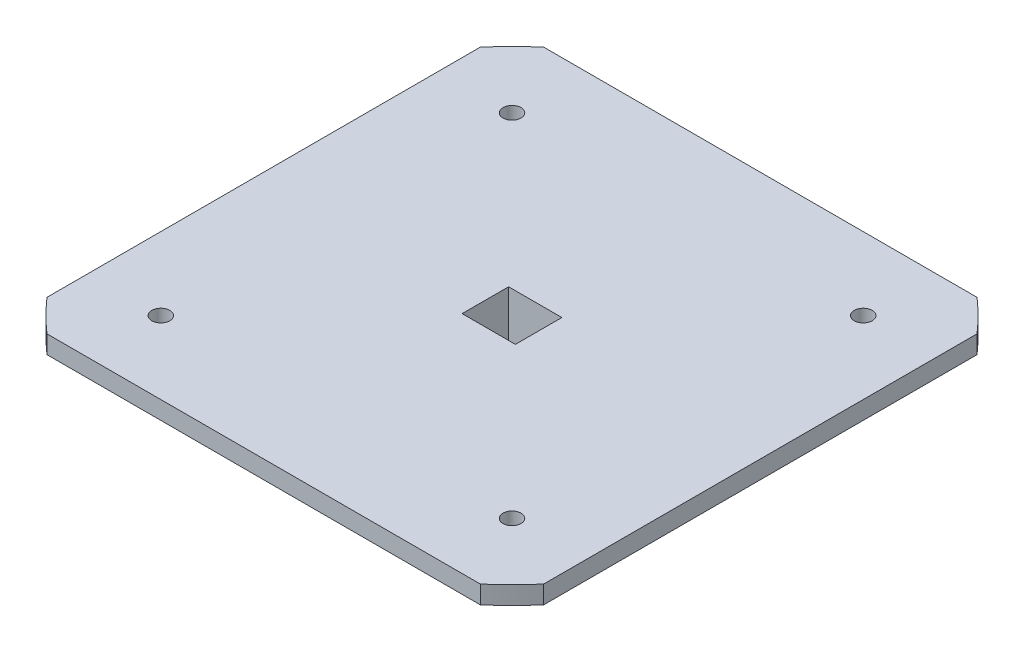
ISO-10303-21;
HEADER;
FILE_DESCRIPTION(('STEP AP214'),'2;1');
FILE_NAME('part.step','',(''),(''),'','','');
FILE_SCHEMA(('AUTOMOTIVE_DESIGN { 1 0 10303 214 1 1 1 1 }'));
ENDSEC;
DATA;
#1=APPLICATION_CONTEXT('core data for automotive mechanical design processes');
#2=APPLICATION_PROTOCOL_DEFINITION('international standard','automotive_design',2000,#1);
#3=PRODUCT_CONTEXT('',#1,'mechanical');
#4=PRODUCT('Part','Part','',(#3));
#5=PRODUCT_RELATED_PRODUCT_CATEGORY('part','',(#4));
#6=PRODUCT_DEFINITION_FORMATION('','',#4);
#7=PRODUCT_DEFINITION_CONTEXT('part definition',#1,'design');
#8=PRODUCT_DEFINITION('design','',#6,#7);
#9=PRODUCT_DEFINITION_SHAPE('','',#8);
#10=(LENGTH_UNIT() NAMED_UNIT(*) SI_UNIT(.MILLI.,.METRE.));
#11=(NAMED_UNIT(*) PLANE_ANGLE_UNIT() SI_UNIT($,.RADIAN.));
#12=(NAMED_UNIT(*) SI_UNIT($,.STERADIAN.) SOLID_ANGLE_UNIT());
#13=UNCERTAINTY_MEASURE_WITH_UNIT(LENGTH_MEASURE(1.E-05),#10,'distance_accuracy_value','');
#14=(GEOMETRIC_REPRESENTATION_CONTEXT(3) GLOBAL_UNCERTAINTY_ASSIGNED_CONTEXT((#13)) GLOBAL_UNIT_ASSIGNED_CONTEXT((#10,
#11,#12)) REPRESENTATION_CONTEXT('',''));
#15=CARTESIAN_POINT('',(0.,0.,0.));
#16=DIRECTION('',(0.,0.,1.));
#17=DIRECTION('',(1.,0.,0.));
#18=AXIS2_PLACEMENT_3D('',#15,#16,#17);
#19=CARTESIAN_POINT('',(-10.9,-12.,-10.15));
#20=DIRECTION('',(0.,0.,1.));
#21=DIRECTION('',(1.,0.,0.));
#22=AXIS2_PLACEMENT_3D('',#19,#20,#21);
#23=PLANE('',#22);
#24=CARTESIAN_POINT('',(0.,-6.,-10.15));
#25=DIRECTION('',(0.,0.,-1.));
#26=DIRECTION('',(-1.,0.,0.));
#27=AXIS2_PLACEMENT_3D('',#24,#25,#26);
#28=CIRCLE('',#27,1.5);
#29=CARTESIAN_POINT('',(-1.11803398874989,-7.,-10.15));
#30=VERTEX_POINT('',#29);
#31=CARTESIAN_POINT('',(1.11803398874989,-7.,-10.15));
#32=VERTEX_POINT('',#31);
#33=EDGE_CURVE('E53',#30,#32,#28,.T.);
#34=ORIENTED_EDGE('',*,*,#33,.F.);
#35=DIRECTION('',(1.,0.,0.));
#36=VECTOR('',#35,1.);
#37=CARTESIAN_POINT('',(-10.9,-7.,-10.15));
#38=LINE('',#37,#36);
#39=CARTESIAN_POINT('',(-10.9,-7.,-10.15));
#40=VERTEX_POINT('',#39);
#41=EDGE_CURVE('E46',#30,#40,#38,.F.);
#42=ORIENTED_EDGE('',*,*,#41,.T.);
#43=DIRECTION('',(0.,1.,0.));
#44=VECTOR('',#43,1.);
#45=CARTESIAN_POINT('',(-10.9,-12.,-10.15));
#46=LINE('',#45,#44);
#47=CARTESIAN_POINT('',(-10.9,0.,-10.15));
#48=VERTEX_POINT('',#47);
#49=EDGE_CURVE('E221',#40,#48,#46,.T.);
#50=ORIENTED_EDGE('',*,*,#49,.T.);
#51=DIRECTION('',(1.,0.,0.));
#52=VECTOR('',#51,1.);
#53=CARTESIAN_POINT('',(-10.9,0.,-10.15));
#54=LINE('',#53,#52);
#55=CARTESIAN_POINT('',(10.9,0.,-10.15));
#56=VERTEX_POINT('',#55);
#57=EDGE_CURVE('E216',#48,#56,#54,.T.);
#58=ORIENTED_EDGE('',*,*,#57,.T.);
#59=DIRECTION('',(0.,1.,0.));
#60=VECTOR('',#59,1.);
#61=CARTESIAN_POINT('',(10.9,-12.,-10.15));
#62=LINE('',#61,#60);
#63=CARTESIAN_POINT('',(10.9,-7.,-10.15));
#64=VERTEX_POINT('',#63);
#65=EDGE_CURVE('E219',#64,#56,#62,.T.);
#66=ORIENTED_EDGE('',*,*,#65,.F.);
#67=EDGE_CURVE('E11',#64,#32,#38,.F.);
#68=ORIENTED_EDGE('',*,*,#67,.T.);
#69=EDGE_LOOP('',(#34,#42,#50,#58,#66,#68));
#70=FACE_BOUND('',#69,.T.);
#71=ADVANCED_FACE('F37',(#70),#23,.F.);
#72=CARTESIAN_POINT('',(0.,0.,0.));
#73=DIRECTION('',(0.,1.,0.));
#74=DIRECTION('',(0.,0.,1.));
#75=AXIS2_PLACEMENT_3D('',#72,#73,#74);
#76=PLANE('',#75);
#77=CARTESIAN_POINT('',(0.,0.,0.));
#78=DIRECTION('',(0.,1.,0.));
#79=DIRECTION('',(0.,0.,1.));
#80=AXIS2_PLACEMENT_3D('',#77,#78,#79);
#81=CIRCLE('',#80,73.);
#82=CARTESIAN_POINT('',(48.,0.,55.));
#83=VERTEX_POINT('',#82);
#84=CARTESIAN_POINT('',(55.,0.,48.));
#85=VERTEX_POINT('',#84);
#86=EDGE_CURVE('E269',#83,#85,#81,.T.);
#87=ORIENTED_EDGE('',*,*,#86,.F.);
#88=DIRECTION('',(1.,0.,0.));
#89=VECTOR('',#88,1.);
#90=CARTESIAN_POINT('',(48.,0.,55.));
#91=LINE('',#90,#89);
#92=CARTESIAN_POINT('',(-48.,0.,55.));
#93=VERTEX_POINT('',#92);
#94=EDGE_CURVE('E274',#93,#83,#91,.T.);
#95=ORIENTED_EDGE('',*,*,#94,.F.);
#96=CARTESIAN_POINT('',(0.,0.,0.));
#97=DIRECTION('',(0.,1.,0.));
#98=DIRECTION('',(0.,0.,1.));
#99=AXIS2_PLACEMENT_3D('',#96,#97,#98);
#100=CIRCLE('',#99,73.);
#101=CARTESIAN_POINT('',(-55.,0.,48.));
#102=VERTEX_POINT('',#101);
#103=EDGE_CURVE('E301',#102,#93,#100,.T.);
#104=ORIENTED_EDGE('',*,*,#103,.F.);
#105=DIRECTION('',(0.,0.,1.));
#106=VECTOR('',#105,1.);
#107=CARTESIAN_POINT('',(-55.,0.,48.));
#108=LINE('',#107,#106);
#109=CARTESIAN_POINT('',(-55.,0.,-48.));
#110=VERTEX_POINT('',#109);
#111=EDGE_CURVE('E299',#110,#102,#108,.T.);
#112=ORIENTED_EDGE('',*,*,#111,.F.);
#113=CARTESIAN_POINT('',(0.,0.,0.));
#114=DIRECTION('',(0.,1.,0.));
#115=DIRECTION('',(0.,0.,1.));
#116=AXIS2_PLACEMENT_3D('',#113,#114,#115);
#117=CIRCLE('',#116,73.);
#118=CARTESIAN_POINT('',(-48.,0.,-55.));
#119=VERTEX_POINT('',#118);
#120=EDGE_CURVE('E297',#119,#110,#117,.T.);
#121=ORIENTED_EDGE('',*,*,#120,.F.);
#122=DIRECTION('',(-1.,0.,0.));
#123=VECTOR('',#122,1.);
#124=CARTESIAN_POINT('',(-48.,0.,-55.));
#125=LINE('',#124,#123);
#126=CARTESIAN_POINT('',(48.,0.,-55.));
#127=VERTEX_POINT('',#126);
#128=EDGE_CURVE('E295',#127,#119,#125,.T.);
#129=ORIENTED_EDGE('',*,*,#128,.F.);
#130=CARTESIAN_POINT('',(0.,0.,0.));
#131=DIRECTION('',(0.,1.,0.));
#132=DIRECTION('',(0.,0.,1.));
#133=AXIS2_PLACEMENT_3D('',#130,#131,#132);
#134=CIRCLE('',#133,73.);
#135=CARTESIAN_POINT('',(55.,0.,-48.));
#136=VERTEX_POINT('',#135);
#137=EDGE_CURVE('E293',#136,#127,#134,.T.);
#138=ORIENTED_EDGE('',*,*,#137,.F.);
#139=DIRECTION('',(0.,0.,-1.));
#140=VECTOR('',#139,1.);
#141=CARTESIAN_POINT('',(55.,0.,-48.));
#142=LINE('',#141,#140);
#143=EDGE_CURVE('E291',#85,#136,#142,.T.);
#144=ORIENTED_EDGE('',*,*,#143,.F.);
#145=EDGE_LOOP('',(#87,#95,#104,#112,#121,#129,#138,#144));
#146=FACE_BOUND('',#145,.T.);
#147=CARTESIAN_POINT('',(-38.8908729652603,0.,-38.8908729652599));
#148=DIRECTION('',(0.,1.,0.));
#149=DIRECTION('',(0.,0.,1.));
#150=AXIS2_PLACEMENT_3D('',#147,#148,#149);
#151=CIRCLE('',#150,2.);
#152=CARTESIAN_POINT('',(-38.8908729652603,0.,-36.8908729652599));
#153=VERTEX_POINT('',#152);
#154=EDGE_CURVE('E266',#153,#153,#151,.T.);
#155=ORIENTED_EDGE('',*,*,#154,.T.);
#156=EDGE_LOOP('',(#155));
#157=FACE_BOUND('',#156,.T.);
#158=CARTESIAN_POINT('',(-38.8908729652599,0.,38.8908729652603));
#159=DIRECTION('',(0.,1.,0.));
#160=DIRECTION('',(0.,0.,1.));
#161=AXIS2_PLACEMENT_3D('',#158,#159,#160);
#162=CIRCLE('',#161,2.);
#163=CARTESIAN_POINT('',(-38.8908729652599,0.,40.8908729652603));
#164=VERTEX_POINT('',#163);
#165=EDGE_CURVE('E260',#164,#164,#162,.T.);
#166=ORIENTED_EDGE('',*,*,#165,.T.);
#167=EDGE_LOOP('',(#166));
#168=FACE_BOUND('',#167,.T.);
#169=CARTESIAN_POINT('',(38.8908729652603,0.,38.8908729652599));
#170=DIRECTION('',(0.,1.,0.));
#171=DIRECTION('',(0.,0.,1.));
#172=AXIS2_PLACEMENT_3D('',#169,#170,#171);
#173=CIRCLE('',#172,2.);
#174=CARTESIAN_POINT('',(38.8908729652603,0.,40.8908729652599));
#175=VERTEX_POINT('',#174);
#176=EDGE_CURVE('E254',#175,#175,#173,.T.);
#177=ORIENTED_EDGE('',*,*,#176,.T.);
#178=EDGE_LOOP('',(#177));
#179=FACE_BOUND('',#178,.T.);
#180=CARTESIAN_POINT('',(38.8908729652599,0.,-38.8908729652603));
#181=DIRECTION('',(0.,1.,0.));
#182=DIRECTION('',(0.,0.,1.));
#183=AXIS2_PLACEMENT_3D('',#180,#181,#182);
#184=CIRCLE('',#183,2.);
#185=CARTESIAN_POINT('',(38.8908729652599,0.,-36.8908729652603));
#186=VERTEX_POINT('',#185);
#187=EDGE_CURVE('E248',#186,#186,#184,.T.);
#188=ORIENTED_EDGE('',*,*,#187,.T.);
#189=EDGE_LOOP('',(#188));
#190=FACE_BOUND('',#189,.T.);
#191=DIRECTION('',(0.,0.,1.));
#192=VECTOR('',#191,1.);
#193=CARTESIAN_POINT('',(10.9,0.,-10.15));
#194=LINE('',#193,#192);
#195=CARTESIAN_POINT('',(10.9,0.,10.15));
#196=VERTEX_POINT('',#195);
#197=EDGE_CURVE('E207',#56,#196,#194,.T.);
#198=ORIENTED_EDGE('',*,*,#197,.F.);
#199=ORIENTED_EDGE('',*,*,#57,.F.);
#200=DIRECTION('',(0.,0.,-1.));
#201=VECTOR('',#200,1.);
#202=CARTESIAN_POINT('',(-10.9,0.,10.15));
#203=LINE('',#202,#201);
#204=CARTESIAN_POINT('',(-10.9,0.,10.15));
#205=VERTEX_POINT('',#204);
#206=EDGE_CURVE('E213',#205,#48,#203,.T.);
#207=ORIENTED_EDGE('',*,*,#206,.F.);
#208=DIRECTION('',(-1.,0.,0.));
#209=VECTOR('',#208,1.);
#210=CARTESIAN_POINT('',(10.9,0.,10.15));
#211=LINE('',#210,#209);
#212=EDGE_CURVE('E210',#196,#205,#211,.T.);
#213=ORIENTED_EDGE('',*,*,#212,.F.);
#214=EDGE_LOOP('',(#198,#199,#207,#213));
#215=FACE_BOUND('',#214,.T.);
#216=ADVANCED_FACE('F358',(#146,#157,#168,#179,#190,#215),#76,.F.);
#217=CARTESIAN_POINT('',(0.,4.,0.));
#218=DIRECTION('',(0.,-1.,0.));
#219=DIRECTION('',(0.,0.,-1.));
#220=AXIS2_PLACEMENT_3D('',#217,#218,#219);
#221=CYLINDRICAL_SURFACE('',#220,73.);
#222=ORIENTED_EDGE('',*,*,#86,.T.);
#223=DIRECTION('',(0.,-1.,0.));
#224=VECTOR('',#223,1.);
#225=CARTESIAN_POINT('',(55.,4.,48.));
#226=LINE('',#225,#224);
#227=CARTESIAN_POINT('',(55.,4.,48.));
#228=VERTEX_POINT('',#227);
#229=EDGE_CURVE('E324',#228,#85,#226,.T.);
#230=ORIENTED_EDGE('',*,*,#229,.F.);
#231=CARTESIAN_POINT('',(0.,4.,0.));
#232=DIRECTION('',(0.,1.,0.));
#233=DIRECTION('',(0.,0.,1.));
#234=AXIS2_PLACEMENT_3D('',#231,#232,#233);
#235=CIRCLE('',#234,73.);
#236=CARTESIAN_POINT('',(48.,4.,55.));
#237=VERTEX_POINT('',#236);
#238=EDGE_CURVE('E270',#237,#228,#235,.T.);
#239=ORIENTED_EDGE('',*,*,#238,.F.);
#240=DIRECTION('',(0.,-1.,0.));
#241=VECTOR('',#240,1.);
#242=CARTESIAN_POINT('',(48.,4.,55.));
#243=LINE('',#242,#241);
#244=EDGE_CURVE('E288',#237,#83,#243,.T.);
#245=ORIENTED_EDGE('',*,*,#244,.T.);
#246=EDGE_LOOP('',(#222,#230,#239,#245));
#247=FACE_BOUND('',#246,.T.);
#248=ADVANCED_FACE('F360',(#247),#221,.T.);
#249=CARTESIAN_POINT('',(55.,4.,-48.));
#250=DIRECTION('',(-1.,0.,0.));
#251=DIRECTION('',(0.,0.,1.));
#252=AXIS2_PLACEMENT_3D('',#249,#250,#251);
#253=PLANE('',#252);
#254=ORIENTED_EDGE('',*,*,#143,.T.);
#255=DIRECTION('',(0.,-1.,0.));
#256=VECTOR('',#255,1.);
#257=CARTESIAN_POINT('',(55.,4.,-48.));
#258=LINE('',#257,#256);
#259=CARTESIAN_POINT('',(55.,4.,-48.));
#260=VERTEX_POINT('',#259);
#261=EDGE_CURVE('E321',#260,#136,#258,.T.);
#262=ORIENTED_EDGE('',*,*,#261,.F.);
#263=DIRECTION('',(0.,0.,-1.));
#264=VECTOR('',#263,1.);
#265=CARTESIAN_POINT('',(55.,4.,-48.));
#266=LINE('',#265,#264);
#267=EDGE_CURVE('E273',#228,#260,#266,.T.);
#268=ORIENTED_EDGE('',*,*,#267,.F.);
#269=ORIENTED_EDGE('',*,*,#229,.T.);
#270=EDGE_LOOP('',(#254,#262,#268,#269));
#271=FACE_BOUND('',#270,.T.);
#272=ADVANCED_FACE('F367',(#271),#253,.F.);
#273=CARTESIAN_POINT('',(0.,4.,0.));
#274=DIRECTION('',(0.,-1.,0.));
#275=DIRECTION('',(0.,0.,-1.));
#276=AXIS2_PLACEMENT_3D('',#273,#274,#275);
#277=CYLINDRICAL_SURFACE('',#276,73.);
#278=ORIENTED_EDGE('',*,*,#137,.T.);
#279=DIRECTION('',(0.,-1.,0.));
#280=VECTOR('',#279,1.);
#281=CARTESIAN_POINT('',(48.,4.,-55.));
#282=LINE('',#281,#280);
#283=CARTESIAN_POINT('',(48.,4.,-55.));
#284=VERTEX_POINT('',#283);
#285=EDGE_CURVE('E318',#284,#127,#282,.T.);
#286=ORIENTED_EDGE('',*,*,#285,.F.);
#287=CARTESIAN_POINT('',(0.,4.,0.));
#288=DIRECTION('',(0.,1.,0.));
#289=DIRECTION('',(0.,0.,1.));
#290=AXIS2_PLACEMENT_3D('',#287,#288,#289);
#291=CIRCLE('',#290,73.);
#292=EDGE_CURVE('E276',#260,#284,#291,.T.);
#293=ORIENTED_EDGE('',*,*,#292,.F.);
#294=ORIENTED_EDGE('',*,*,#261,.T.);
#295=EDGE_LOOP('',(#278,#286,#293,#294));
#296=FACE_BOUND('',#295,.T.);
#297=ADVANCED_FACE('F396',(#296),#277,.T.);
#298=CARTESIAN_POINT('',(-48.,4.,-55.));
#299=DIRECTION('',(0.,0.,1.));
#300=DIRECTION('',(1.,0.,0.));
#301=AXIS2_PLACEMENT_3D('',#298,#299,#300);
#302=PLANE('',#301);
#303=ORIENTED_EDGE('',*,*,#128,.T.);
#304=DIRECTION('',(0.,-1.,0.));
#305=VECTOR('',#304,1.);
#306=CARTESIAN_POINT('',(-48.,4.,-55.));
#307=LINE('',#306,#305);
#308=CARTESIAN_POINT('',(-48.,4.,-55.));
#309=VERTEX_POINT('',#308);
#310=EDGE_CURVE('E315',#309,#119,#307,.T.);
#311=ORIENTED_EDGE('',*,*,#310,.F.);
#312=DIRECTION('',(-1.,0.,0.));
#313=VECTOR('',#312,1.);
#314=CARTESIAN_POINT('',(-48.,4.,-55.));
#315=LINE('',#314,#313);
#316=EDGE_CURVE('E278',#284,#309,#315,.T.);
#317=ORIENTED_EDGE('',*,*,#316,.F.);
#318=ORIENTED_EDGE('',*,*,#285,.T.);
#319=EDGE_LOOP('',(#303,#311,#317,#318));
#320=FACE_BOUND('',#319,.T.);
#321=ADVANCED_FACE('F392',(#320),#302,.F.);
#322=CARTESIAN_POINT('',(0.,4.,0.));
#323=DIRECTION('',(0.,-1.,0.));
#324=DIRECTION('',(0.,0.,-1.));
#325=AXIS2_PLACEMENT_3D('',#322,#323,#324);
#326=CYLINDRICAL_SURFACE('',#325,73.);
#327=ORIENTED_EDGE('',*,*,#120,.T.);
#328=DIRECTION('',(0.,-1.,0.));
#329=VECTOR('',#328,1.);
#330=CARTESIAN_POINT('',(-55.,4.,-48.));
#331=LINE('',#330,#329);
#332=CARTESIAN_POINT('',(-55.,4.,-48.));
#333=VERTEX_POINT('',#332);
#334=EDGE_CURVE('E312',#333,#110,#331,.T.);
#335=ORIENTED_EDGE('',*,*,#334,.F.);
#336=CARTESIAN_POINT('',(0.,4.,0.));
#337=DIRECTION('',(0.,1.,0.));
#338=DIRECTION('',(0.,0.,1.));
#339=AXIS2_PLACEMENT_3D('',#336,#337,#338);
#340=CIRCLE('',#339,73.);
#341=EDGE_CURVE('E280',#309,#333,#340,.T.);
#342=ORIENTED_EDGE('',*,*,#341,.F.);
#343=ORIENTED_EDGE('',*,*,#310,.T.);
#344=EDGE_LOOP('',(#327,#335,#342,#343));
#345=FACE_BOUND('',#344,.T.);
#346=ADVANCED_FACE('F388',(#345),#326,.T.);
#347=CARTESIAN_POINT('',(-55.,4.,48.));
#348=DIRECTION('',(1.,0.,0.));
#349=DIRECTION('',(0.,0.,-1.));
#350=AXIS2_PLACEMENT_3D('',#347,#348,#349);
#351=PLANE('',#350);
#352=ORIENTED_EDGE('',*,*,#111,.T.);
#353=DIRECTION('',(0.,-1.,0.));
#354=VECTOR('',#353,1.);
#355=CARTESIAN_POINT('',(-55.,4.,48.));
#356=LINE('',#355,#354);
#357=CARTESIAN_POINT('',(-55.,4.,48.));
#358=VERTEX_POINT('',#357);
#359=EDGE_CURVE('E309',#358,#102,#356,.T.);
#360=ORIENTED_EDGE('',*,*,#359,.F.);
#361=DIRECTION('',(0.,0.,1.));
#362=VECTOR('',#361,1.);
#363=CARTESIAN_POINT('',(-55.,4.,48.));
#364=LINE('',#363,#362);
#365=EDGE_CURVE('E282',#333,#358,#364,.T.);
#366=ORIENTED_EDGE('',*,*,#365,.F.);
#367=ORIENTED_EDGE('',*,*,#334,.T.);
#368=EDGE_LOOP('',(#352,#360,#366,#367));
#369=FACE_BOUND('',#368,.T.);
#370=ADVANCED_FACE('F384',(#369),#351,.F.);
#371=CARTESIAN_POINT('',(0.,4.,0.));
#372=DIRECTION('',(0.,-1.,0.));
#373=DIRECTION('',(0.,0.,-1.));
#374=AXIS2_PLACEMENT_3D('',#371,#372,#373);
#375=CYLINDRICAL_SURFACE('',#374,73.);
#376=ORIENTED_EDGE('',*,*,#103,.T.);
#377=DIRECTION('',(0.,-1.,0.));
#378=VECTOR('',#377,1.);
#379=CARTESIAN_POINT('',(-48.,4.,55.));
#380=LINE('',#379,#378);
#381=CARTESIAN_POINT('',(-48.,4.,55.));
#382=VERTEX_POINT('',#381);
#383=EDGE_CURVE('E306',#382,#93,#380,.T.);
#384=ORIENTED_EDGE('',*,*,#383,.F.);
#385=CARTESIAN_POINT('',(0.,4.,0.));
#386=DIRECTION('',(0.,1.,0.));
#387=DIRECTION('',(0.,0.,1.));
#388=AXIS2_PLACEMENT_3D('',#385,#386,#387);
#389=CIRCLE('',#388,73.);
#390=EDGE_CURVE('E284',#358,#382,#389,.T.);
#391=ORIENTED_EDGE('',*,*,#390,.F.);
#392=ORIENTED_EDGE('',*,*,#359,.T.);
#393=EDGE_LOOP('',(#376,#384,#391,#392));
#394=FACE_BOUND('',#393,.T.);
#395=ADVANCED_FACE('F380',(#394),#375,.T.);
#396=CARTESIAN_POINT('',(48.,4.,55.));
#397=DIRECTION('',(0.,0.,-1.));
#398=DIRECTION('',(-1.,0.,0.));
#399=AXIS2_PLACEMENT_3D('',#396,#397,#398);
#400=PLANE('',#399);
#401=ORIENTED_EDGE('',*,*,#94,.T.);
#402=ORIENTED_EDGE('',*,*,#244,.F.);
#403=DIRECTION('',(1.,0.,0.));
#404=VECTOR('',#403,1.);
#405=CARTESIAN_POINT('',(48.,4.,55.));
#406=LINE('',#405,#404);
#407=EDGE_CURVE('E286',#382,#237,#406,.T.);
#408=ORIENTED_EDGE('',*,*,#407,.F.);
#409=ORIENTED_EDGE('',*,*,#383,.T.);
#410=EDGE_LOOP('',(#401,#402,#408,#409));
#411=FACE_BOUND('',#410,.T.);
#412=ADVANCED_FACE('F377',(#411),#400,.F.);
#413=CARTESIAN_POINT('',(0.,4.,0.));
#414=DIRECTION('',(0.,1.,0.));
#415=DIRECTION('',(0.,0.,1.));
#416=AXIS2_PLACEMENT_3D('',#413,#414,#415);
#417=PLANE('',#416);
#418=DIRECTION('',(0.,0.,-1.));
#419=VECTOR('',#418,1.);
#420=CARTESIAN_POINT('',(5.9,4.,0.));
#421=LINE('',#420,#419);
#422=CARTESIAN_POINT('',(5.9,4.,5.15));
#423=VERTEX_POINT('',#422);
#424=CARTESIAN_POINT('',(5.9,4.,-5.15));
#425=VERTEX_POINT('',#424);
#426=EDGE_CURVE('E243',#423,#425,#421,.T.);
#427=ORIENTED_EDGE('',*,*,#426,.F.);
#428=DIRECTION('',(1.,0.,0.));
#429=VECTOR('',#428,1.);
#430=CARTESIAN_POINT('',(0.,4.,5.15));
#431=LINE('',#430,#429);
#432=CARTESIAN_POINT('',(-5.9,4.,5.15));
#433=VERTEX_POINT('',#432);
#434=EDGE_CURVE('E230',#433,#423,#431,.T.);
#435=ORIENTED_EDGE('',*,*,#434,.F.);
#436=DIRECTION('',(0.,0.,1.));
#437=VECTOR('',#436,1.);
#438=CARTESIAN_POINT('',(-5.9,4.,0.));
#439=LINE('',#438,#437);
#440=CARTESIAN_POINT('',(-5.9,4.,-5.15));
#441=VERTEX_POINT('',#440);
#442=EDGE_CURVE('E238',#441,#433,#439,.T.);
#443=ORIENTED_EDGE('',*,*,#442,.F.);
#444=DIRECTION('',(-1.,0.,0.));
#445=VECTOR('',#444,1.);
#446=CARTESIAN_POINT('',(0.,4.,-5.15));
#447=LINE('',#446,#445);
#448=EDGE_CURVE('E241',#425,#441,#447,.T.);
#449=ORIENTED_EDGE('',*,*,#448,.F.);
#450=EDGE_LOOP('',(#427,#435,#443,#449));
#451=FACE_BOUND('',#450,.T.);
#452=CARTESIAN_POINT('',(38.8908729652599,4.,-38.8908729652603));
#453=DIRECTION('',(0.,1.,0.));
#454=DIRECTION('',(0.,0.,1.));
#455=AXIS2_PLACEMENT_3D('',#452,#453,#454);
#456=CIRCLE('',#455,1.99999999999999);
#457=CARTESIAN_POINT('',(38.8908729652599,4.,-36.8908729652603));
#458=VERTEX_POINT('',#457);
#459=EDGE_CURVE('E245',#458,#458,#456,.T.);
#460=ORIENTED_EDGE('',*,*,#459,.F.);
#461=EDGE_LOOP('',(#460));
#462=FACE_BOUND('',#461,.T.);
#463=CARTESIAN_POINT('',(38.8908729652603,4.,38.8908729652599));
#464=DIRECTION('',(0.,1.,0.));
#465=DIRECTION('',(0.,0.,1.));
#466=AXIS2_PLACEMENT_3D('',#463,#464,#465);
#467=CIRCLE('',#466,1.99999999999999);
#468=CARTESIAN_POINT('',(38.8908729652603,4.,40.8908729652599));
#469=VERTEX_POINT('',#468);
#470=EDGE_CURVE('E251',#469,#469,#467,.T.);
#471=ORIENTED_EDGE('',*,*,#470,.F.);
#472=EDGE_LOOP('',(#471));
#473=FACE_BOUND('',#472,.T.);
#474=CARTESIAN_POINT('',(-38.8908729652599,4.,38.8908729652603));
#475=DIRECTION('',(0.,1.,0.));
#476=DIRECTION('',(0.,0.,1.));
#477=AXIS2_PLACEMENT_3D('',#474,#475,#476);
#478=CIRCLE('',#477,1.99999999999999);
#479=CARTESIAN_POINT('',(-38.8908729652599,4.,40.8908729652603));
#480=VERTEX_POINT('',#479);
#481=EDGE_CURVE('E257',#480,#480,#478,.T.);
#482=ORIENTED_EDGE('',*,*,#481,.F.);
#483=EDGE_LOOP('',(#482));
#484=FACE_BOUND('',#483,.T.);
#485=CARTESIAN_POINT('',(-38.8908729652603,4.,-38.8908729652599));
#486=DIRECTION('',(0.,1.,0.));
#487=DIRECTION('',(0.,0.,1.));
#488=AXIS2_PLACEMENT_3D('',#485,#486,#487);
#489=CIRCLE('',#488,1.99999999999999);
#490=CARTESIAN_POINT('',(-38.8908729652603,4.,-36.8908729652599));
#491=VERTEX_POINT('',#490);
#492=EDGE_CURVE('E263',#491,#491,#489,.T.);
#493=ORIENTED_EDGE('',*,*,#492,.F.);
#494=EDGE_LOOP('',(#493));
#495=FACE_BOUND('',#494,.T.);
#496=ORIENTED_EDGE('',*,*,#238,.T.);
#497=ORIENTED_EDGE('',*,*,#267,.T.);
#498=ORIENTED_EDGE('',*,*,#292,.T.);
#499=ORIENTED_EDGE('',*,*,#316,.T.);
#500=ORIENTED_EDGE('',*,*,#341,.T.);
#501=ORIENTED_EDGE('',*,*,#365,.T.);
#502=ORIENTED_EDGE('',*,*,#390,.T.);
#503=ORIENTED_EDGE('',*,*,#407,.T.);
#504=EDGE_LOOP('',(#496,#497,#498,#499,#500,#501,#502,#503));
#505=FACE_BOUND('',#504,.T.);
#506=ADVANCED_FACE('F375',(#451,#462,#473,#484,#495,#505),#417,.T.);
#507=CARTESIAN_POINT('',(-38.8908729652603,4.,-38.8908729652599));
#508=DIRECTION('',(0.,1.,0.));
#509=DIRECTION('',(0.,0.,1.));
#510=AXIS2_PLACEMENT_3D('',#507,#508,#509);
#511=CYLINDRICAL_SURFACE('',#510,1.99999999999999);
#512=ORIENTED_EDGE('',*,*,#154,.F.);
#513=EDGE_LOOP('',(#512));
#514=FACE_BOUND('',#513,.T.);
#515=ORIENTED_EDGE('',*,*,#492,.T.);
#516=EDGE_LOOP('',(#515));
#517=FACE_BOUND('',#516,.T.);
#518=ADVANCED_FACE('F443',(#514,#517),#511,.F.);
#519=CARTESIAN_POINT('',(-38.8908729652599,4.,38.8908729652603));
#520=DIRECTION('',(0.,1.,0.));
#521=DIRECTION('',(0.,0.,1.));
#522=AXIS2_PLACEMENT_3D('',#519,#520,#521);
#523=CYLINDRICAL_SURFACE('',#522,1.99999999999999);
#524=ORIENTED_EDGE('',*,*,#165,.F.);
#525=EDGE_LOOP('',(#524));
#526=FACE_BOUND('',#525,.T.);
#527=ORIENTED_EDGE('',*,*,#481,.T.);
#528=EDGE_LOOP('',(#527));
#529=FACE_BOUND('',#528,.T.);
#530=ADVANCED_FACE('F440',(#526,#529),#523,.F.);
#531=CARTESIAN_POINT('',(38.8908729652603,4.,38.8908729652599));
#532=DIRECTION('',(0.,1.,0.));
#533=DIRECTION('',(0.,0.,1.));
#534=AXIS2_PLACEMENT_3D('',#531,#532,#533);
#535=CYLINDRICAL_SURFACE('',#534,1.99999999999999);
#536=ORIENTED_EDGE('',*,*,#176,.F.);
#537=EDGE_LOOP('',(#536));
#538=FACE_BOUND('',#537,.T.);
#539=ORIENTED_EDGE('',*,*,#470,.T.);
#540=EDGE_LOOP('',(#539));
#541=FACE_BOUND('',#540,.T.);
#542=ADVANCED_FACE('F436',(#538,#541),#535,.F.);
#543=CARTESIAN_POINT('',(38.8908729652599,4.,-38.8908729652603));
#544=DIRECTION('',(0.,1.,0.));
#545=DIRECTION('',(0.,0.,1.));
#546=AXIS2_PLACEMENT_3D('',#543,#544,#545);
#547=CYLINDRICAL_SURFACE('',#546,1.99999999999999);
#548=ORIENTED_EDGE('',*,*,#187,.F.);
#549=EDGE_LOOP('',(#548));
#550=FACE_BOUND('',#549,.T.);
#551=ORIENTED_EDGE('',*,*,#459,.T.);
#552=EDGE_LOOP('',(#551));
#553=FACE_BOUND('',#552,.T.);
#554=ADVANCED_FACE('F433',(#550,#553),#547,.F.);
#555=CARTESIAN_POINT('',(5.9,10.,-5.15));
#556=DIRECTION('',(1.,0.,0.));
#557=DIRECTION('',(0.,0.,-1.));
#558=AXIS2_PLACEMENT_3D('',#555,#556,#557);
#559=PLANE('',#558);
#560=ORIENTED_EDGE('',*,*,#426,.T.);
#561=DIRECTION('',(0.,-1.,0.));
#562=VECTOR('',#561,1.);
#563=CARTESIAN_POINT('',(5.9,10.,-5.15));
#564=LINE('',#563,#562);
#565=CARTESIAN_POINT('',(5.9,-12.,-5.15));
#566=VERTEX_POINT('',#565);
#567=EDGE_CURVE('E228',#425,#566,#564,.T.);
#568=ORIENTED_EDGE('',*,*,#567,.T.);
#569=DIRECTION('',(0.,0.,1.));
#570=VECTOR('',#569,1.);
#571=CARTESIAN_POINT('',(5.9,-12.,-5.15));
#572=LINE('',#571,#570);
#573=CARTESIAN_POINT('',(5.9,-12.,5.15));
#574=VERTEX_POINT('',#573);
#575=EDGE_CURVE('E204',#566,#574,#572,.T.);
#576=ORIENTED_EDGE('',*,*,#575,.T.);
#577=DIRECTION('',(0.,-1.,0.));
#578=VECTOR('',#577,1.);
#579=CARTESIAN_POINT('',(5.9,10.,5.15));
#580=LINE('',#579,#578);
#581=EDGE_CURVE('E227',#423,#574,#580,.T.);
#582=ORIENTED_EDGE('',*,*,#581,.F.);
#583=EDGE_LOOP('',(#560,#568,#576,#582));
#584=FACE_BOUND('',#583,.T.);
#585=ADVANCED_FACE('F339',(#584),#559,.F.);
#586=CARTESIAN_POINT('',(-5.9,10.,-5.15));
#587=DIRECTION('',(0.,0.,-1.));
#588=DIRECTION('',(-1.,0.,0.));
#589=AXIS2_PLACEMENT_3D('',#586,#587,#588);
#590=PLANE('',#589);
#591=CARTESIAN_POINT('',(0.,-6.,-5.15));
#592=DIRECTION('',(0.,0.,-1.));
#593=DIRECTION('',(-1.,0.,0.));
#594=AXIS2_PLACEMENT_3D('',#591,#592,#593);
#595=CIRCLE('',#594,1.5);
#596=CARTESIAN_POINT('',(-1.5,-6.,-5.15));
#597=VERTEX_POINT('',#596);
#598=EDGE_CURVE('E163',#597,#597,#595,.T.);
#599=ORIENTED_EDGE('',*,*,#598,.T.);
#600=EDGE_LOOP('',(#599));
#601=FACE_BOUND('',#600,.T.);
#602=ORIENTED_EDGE('',*,*,#448,.T.);
#603=DIRECTION('',(0.,-1.,0.));
#604=VECTOR('',#603,1.);
#605=CARTESIAN_POINT('',(-5.9,10.,-5.15));
#606=LINE('',#605,#604);
#607=CARTESIAN_POINT('',(-5.9,-12.,-5.15));
#608=VERTEX_POINT('',#607);
#609=EDGE_CURVE('E231',#441,#608,#606,.T.);
#610=ORIENTED_EDGE('',*,*,#609,.T.);
#611=DIRECTION('',(1.,0.,0.));
#612=VECTOR('',#611,1.);
#613=CARTESIAN_POINT('',(-5.9,-12.,-5.15));
#614=LINE('',#613,#612);
#615=EDGE_CURVE('E192',#608,#566,#614,.T.);
#616=ORIENTED_EDGE('',*,*,#615,.T.);
#617=ORIENTED_EDGE('',*,*,#567,.F.);
#618=EDGE_LOOP('',(#602,#610,#616,#617));
#619=FACE_BOUND('',#618,.T.);
#620=ADVANCED_FACE('F344',(#601,#619),#590,.F.);
#621=CARTESIAN_POINT('',(-5.9,10.,-5.15));
#622=DIRECTION('',(-1.,0.,0.));
#623=DIRECTION('',(0.,0.,1.));
#624=AXIS2_PLACEMENT_3D('',#621,#622,#623);
#625=PLANE('',#624);
#626=ORIENTED_EDGE('',*,*,#442,.T.);
#627=DIRECTION('',(0.,-1.,0.));
#628=VECTOR('',#627,1.);
#629=CARTESIAN_POINT('',(-5.9,10.,5.15));
#630=LINE('',#629,#628);
#631=CARTESIAN_POINT('',(-5.9,-12.,5.15));
#632=VERTEX_POINT('',#631);
#633=EDGE_CURVE('E234',#433,#632,#630,.T.);
#634=ORIENTED_EDGE('',*,*,#633,.T.);
#635=DIRECTION('',(0.,0.,-1.));
#636=VECTOR('',#635,1.);
#637=CARTESIAN_POINT('',(-5.9,-12.,5.15));
#638=LINE('',#637,#636);
#639=EDGE_CURVE('E187',#632,#608,#638,.T.);
#640=ORIENTED_EDGE('',*,*,#639,.T.);
#641=ORIENTED_EDGE('',*,*,#609,.F.);
#642=EDGE_LOOP('',(#626,#634,#640,#641));
#643=FACE_BOUND('',#642,.T.);
#644=ADVANCED_FACE('F349',(#643),#625,.F.);
#645=CARTESIAN_POINT('',(-5.9,10.,5.15));
#646=DIRECTION('',(0.,0.,1.));
#647=DIRECTION('',(1.,0.,0.));
#648=AXIS2_PLACEMENT_3D('',#645,#646,#647);
#649=PLANE('',#648);
#650=ORIENTED_EDGE('',*,*,#434,.T.);
#651=ORIENTED_EDGE('',*,*,#581,.T.);
#652=DIRECTION('',(-1.,0.,0.));
#653=VECTOR('',#652,1.);
#654=CARTESIAN_POINT('',(5.9,-12.,5.15));
#655=LINE('',#654,#653);
#656=EDGE_CURVE('E181',#574,#632,#655,.T.);
#657=ORIENTED_EDGE('',*,*,#656,.T.);
#658=ORIENTED_EDGE('',*,*,#633,.F.);
#659=EDGE_LOOP('',(#650,#651,#657,#658));
#660=FACE_BOUND('',#659,.T.);
#661=ADVANCED_FACE('F423',(#660),#649,.F.);
#662=CARTESIAN_POINT('',(10.9,-12.,-10.15));
#663=DIRECTION('',(-1.,0.,0.));
#664=DIRECTION('',(0.,0.,1.));
#665=AXIS2_PLACEMENT_3D('',#662,#663,#664);
#666=PLANE('',#665);
#667=DIRECTION('',(0.,1.,0.));
#668=VECTOR('',#667,1.);
#669=CARTESIAN_POINT('',(10.9,-12.,10.15));
#670=LINE('',#669,#668);
#671=CARTESIAN_POINT('',(10.9,-7.,10.15));
#672=VERTEX_POINT('',#671);
#673=EDGE_CURVE('E225',#672,#196,#670,.T.);
#674=ORIENTED_EDGE('',*,*,#673,.F.);
#675=DIRECTION('',(0.,0.,1.));
#676=VECTOR('',#675,1.);
#677=CARTESIAN_POINT('',(10.9,-7.,-10.15));
#678=LINE('',#677,#676);
#679=EDGE_CURVE('E61',#672,#64,#678,.F.);
#680=ORIENTED_EDGE('',*,*,#679,.T.);
#681=ORIENTED_EDGE('',*,*,#65,.T.);
#682=ORIENTED_EDGE('',*,*,#197,.T.);
#683=EDGE_LOOP('',(#674,#680,#681,#682));
#684=FACE_BOUND('',#683,.T.);
#685=ADVANCED_FACE('F333',(#684),#666,.F.);
#686=CARTESIAN_POINT('',(10.9,-12.,10.15));
#687=DIRECTION('',(0.,0.,-1.));
#688=DIRECTION('',(-1.,0.,0.));
#689=AXIS2_PLACEMENT_3D('',#686,#687,#688);
#690=PLANE('',#689);
#691=DIRECTION('',(0.,1.,0.));
#692=VECTOR('',#691,1.);
#693=CARTESIAN_POINT('',(-10.9,-12.,10.15));
#694=LINE('',#693,#692);
#695=CARTESIAN_POINT('',(-10.9,-7.,10.15));
#696=VERTEX_POINT('',#695);
#697=EDGE_CURVE('E223',#696,#205,#694,.T.);
#698=ORIENTED_EDGE('',*,*,#697,.F.);
#699=DIRECTION('',(-1.,0.,0.));
#700=VECTOR('',#699,1.);
#701=CARTESIAN_POINT('',(10.9,-7.,10.15));
#702=LINE('',#701,#700);
#703=EDGE_CURVE('E171',#696,#672,#702,.F.);
#704=ORIENTED_EDGE('',*,*,#703,.T.);
#705=ORIENTED_EDGE('',*,*,#673,.T.);
#706=ORIENTED_EDGE('',*,*,#212,.T.);
#707=EDGE_LOOP('',(#698,#704,#705,#706));
#708=FACE_BOUND('',#707,.T.);
#709=ADVANCED_FACE('F331',(#708),#690,.F.);
#710=CARTESIAN_POINT('',(-10.9,-12.,10.15));
#711=DIRECTION('',(1.,0.,0.));
#712=DIRECTION('',(0.,0.,-1.));
#713=AXIS2_PLACEMENT_3D('',#710,#711,#712);
#714=PLANE('',#713);
#715=ORIENTED_EDGE('',*,*,#49,.F.);
#716=DIRECTION('',(0.,0.,-1.));
#717=VECTOR('',#716,1.);
#718=CARTESIAN_POINT('',(-10.9,-7.,10.15));
#719=LINE('',#718,#717);
#720=EDGE_CURVE('E327',#40,#696,#719,.F.);
#721=ORIENTED_EDGE('',*,*,#720,.T.);
#722=ORIENTED_EDGE('',*,*,#697,.T.);
#723=ORIENTED_EDGE('',*,*,#206,.T.);
#724=EDGE_LOOP('',(#715,#721,#722,#723));
#725=FACE_BOUND('',#724,.T.);
#726=ADVANCED_FACE('F354',(#725),#714,.F.);
#727=CARTESIAN_POINT('',(5.9,-7.,0.));
#728=DIRECTION('',(0.,0.,-1.));
#729=DIRECTION('',(-1.,0.,0.));
#730=AXIS2_PLACEMENT_3D('',#727,#728,#729);
#731=CYLINDRICAL_SURFACE('',#730,5.);
#732=CARTESIAN_POINT('',(5.9,-7.,-5.15));
#733=DIRECTION('',(-0.707106781186547,0.,-0.707106781186547));
#734=DIRECTION('',(-0.707106781186548,0.,0.707106781186547));
#735=AXIS2_PLACEMENT_3D('',#732,#733,#734);
#736=ELLIPSE('',#735,7.07106781186547,5.);
#737=EDGE_CURVE('E177',#64,#566,#736,.T.);
#738=ORIENTED_EDGE('',*,*,#737,.F.);
#739=ORIENTED_EDGE('',*,*,#679,.F.);
#740=CARTESIAN_POINT('',(5.9,-7.,5.15));
#741=DIRECTION('',(0.707106781186548,0.,-0.707106781186547));
#742=DIRECTION('',(-0.707106781186547,0.,-0.707106781186548));
#743=AXIS2_PLACEMENT_3D('',#740,#741,#742);
#744=ELLIPSE('',#743,7.07106781186548,5.);
#745=EDGE_CURVE('E41',#574,#672,#744,.F.);
#746=ORIENTED_EDGE('',*,*,#745,.F.);
#747=ORIENTED_EDGE('',*,*,#575,.F.);
#748=EDGE_LOOP('',(#738,#739,#746,#747));
#749=FACE_BOUND('',#748,.T.);
#750=ADVANCED_FACE('F39',(#749),#731,.T.);
#751=CARTESIAN_POINT('',(0.,-7.,5.15));
#752=DIRECTION('',(1.,0.,0.));
#753=DIRECTION('',(0.,0.,-1.));
#754=AXIS2_PLACEMENT_3D('',#751,#752,#753);
#755=CYLINDRICAL_SURFACE('',#754,5.);
#756=ORIENTED_EDGE('',*,*,#745,.T.);
#757=ORIENTED_EDGE('',*,*,#703,.F.);
#758=CARTESIAN_POINT('',(-5.9,-7.,5.15));
#759=DIRECTION('',(0.707106781186547,0.,0.707106781186548));
#760=DIRECTION('',(0.707106781186548,0.,-0.707106781186547));
#761=AXIS2_PLACEMENT_3D('',#758,#759,#760);
#762=ELLIPSE('',#761,7.07106781186547,5.);
#763=EDGE_CURVE('E176',#632,#696,#762,.F.);
#764=ORIENTED_EDGE('',*,*,#763,.F.);
#765=ORIENTED_EDGE('',*,*,#656,.F.);
#766=EDGE_LOOP('',(#756,#757,#764,#765));
#767=FACE_BOUND('',#766,.T.);
#768=ADVANCED_FACE('F407',(#767),#755,.T.);
#769=CARTESIAN_POINT('',(0.,-7.,-5.15));
#770=DIRECTION('',(-1.,0.,0.));
#771=DIRECTION('',(0.,0.,1.));
#772=AXIS2_PLACEMENT_3D('',#769,#770,#771);
#773=CYLINDRICAL_SURFACE('',#772,5.);
#774=CARTESIAN_POINT('',(1.1180339887499,-7.,-10.15));
#775=CARTESIAN_POINT('',(1.08993832336211,-7.03141180200663,-10.1500002197306));
#776=CARTESIAN_POINT('',(1.06053273565898,-7.06162265984099,-10.1497039947792));
#777=CARTESIAN_POINT('',(0.999293730785881,-7.11945847752319,-10.1486563519891));
#778=CARTESIAN_POINT('',(0.967460601937244,-7.14708374359878,-10.1479049881344));
#779=CARTESIAN_POINT('',(0.86870751227012,-7.22572826493368,-10.1451775961946));
#780=CARTESIAN_POINT('',(0.798438679325473,-7.27262241284006,-10.1427273467213));
#781=CARTESIAN_POINT('',(0.651063198264588,-7.35396174009788,-10.1376229630099));
#782=CARTESIAN_POINT('',(0.573954791433413,-7.38840370589505,-10.1349687763553));
#783=CARTESIAN_POINT('',(0.41503928343122,-7.44389054459977,-10.1303353474256));
#784=CARTESIAN_POINT('',(0.333232861758928,-7.4649373496264,-10.1283560078295));
#785=CARTESIAN_POINT('',(0.167098188892426,-7.49304656858534,-10.12565156826));
#786=CARTESIAN_POINT('',(0.0827661570292072,-7.50008683215575,-10.1249284551492));
#787=CARTESIAN_POINT('',(-0.0858827579204739,-7.49991154897713,-10.1249460786204));
#788=CARTESIAN_POINT('',(-0.170199641080065,-7.49269607300189,-10.1256868079351));
#789=CARTESIAN_POINT('',(-0.336035583173046,-7.46428313633744,-10.1284174125758));
#790=CARTESIAN_POINT('',(-0.417565409691256,-7.44314794887336,-10.1304017225344));
#791=CARTESIAN_POINT('',(-0.575933177235814,-7.38756937348258,-10.1350339793967));
#792=CARTESIAN_POINT('',(-0.652770500728305,-7.35312423831719,-10.1376820134136));
#793=CARTESIAN_POINT('',(-0.799601625007776,-7.27187389954352,-10.1427677430848));
#794=CARTESIAN_POINT('',(-0.869599771165467,-7.22507661495022,-10.1452055721785));
#795=CARTESIAN_POINT('',(-0.967986100288397,-7.14663521961891,-10.1479178149541));
#796=CARTESIAN_POINT('',(-0.999703327658238,-7.1190875154016,-10.1486647059688));
#797=CARTESIAN_POINT('',(-1.06072568711581,-7.06142441410431,-10.1497059335598));
#798=CARTESIAN_POINT('',(-1.09003053413031,-7.03130871441554,-10.1500002167234));
#799=CARTESIAN_POINT('',(-1.11803398874989,-7.,-10.15));
#800=B_SPLINE_CURVE_WITH_KNOTS('',3,(#774,#775,#776,#777,#778,#779,#780,#781,#782,#783,#784,
#785,#786,#787,#788,#789,#790,#791,#792,#793,#794,#795,#796,#797,#798,#799),.UNSPECIFIED.,.F.,
.F.,(4,2,2,2,2,2,2,2,2,2,2,2,4),(0.,0.126349375947689,0.25268376856434,0.504930290336409,
0.757241863376878,1.00951703472274,1.26219084541523,1.51486340169086,1.76641317492643,
2.01799598111658,2.26941788662459,2.39533827882675,2.52127352986146),.UNSPECIFIED.);
#801=EDGE_CURVE('E156',#32,#30,#800,.T.);
#802=ORIENTED_EDGE('',*,*,#801,.F.);
#803=ORIENTED_EDGE('',*,*,#67,.F.);
#804=ORIENTED_EDGE('',*,*,#737,.T.);
#805=ORIENTED_EDGE('',*,*,#615,.F.);
#806=CARTESIAN_POINT('',(-5.9,-7.,-5.15));
#807=DIRECTION('',(-0.707106781186548,0.,0.707106781186547));
#808=DIRECTION('',(-0.707106781186547,0.,-0.707106781186548));
#809=AXIS2_PLACEMENT_3D('',#806,#807,#808);
#810=ELLIPSE('',#809,7.07106781186547,5.);
#811=EDGE_CURVE('E162',#40,#608,#810,.T.);
#812=ORIENTED_EDGE('',*,*,#811,.F.);
#813=ORIENTED_EDGE('',*,*,#41,.F.);
#814=EDGE_LOOP('',(#802,#803,#804,#805,#812,#813));
#815=FACE_BOUND('',#814,.T.);
#816=ADVANCED_FACE('F169',(#815),#773,.T.);
#817=CARTESIAN_POINT('',(-5.9,-7.,0.));
#818=DIRECTION('',(0.,0.,1.));
#819=DIRECTION('',(1.,0.,0.));
#820=AXIS2_PLACEMENT_3D('',#817,#818,#819);
#821=CYLINDRICAL_SURFACE('',#820,5.);
#822=ORIENTED_EDGE('',*,*,#763,.T.);
#823=ORIENTED_EDGE('',*,*,#720,.F.);
#824=ORIENTED_EDGE('',*,*,#811,.T.);
#825=ORIENTED_EDGE('',*,*,#639,.F.);
#826=EDGE_LOOP('',(#822,#823,#824,#825));
#827=FACE_BOUND('',#826,.T.);
#828=ADVANCED_FACE('F351',(#827),#821,.T.);
#829=CARTESIAN_POINT('',(0.,-6.,-10.15));
#830=DIRECTION('',(0.,0.,-1.));
#831=DIRECTION('',(-1.,0.,0.));
#832=AXIS2_PLACEMENT_3D('',#829,#830,#831);
#833=CYLINDRICAL_SURFACE('',#832,1.5);
#834=ORIENTED_EDGE('',*,*,#801,.T.);
#835=ORIENTED_EDGE('',*,*,#33,.T.);
#836=EDGE_LOOP('',(#834,#835));
#837=FACE_BOUND('',#836,.T.);
#838=ORIENTED_EDGE('',*,*,#598,.F.);
#839=EDGE_LOOP('',(#838));
#840=FACE_BOUND('',#839,.T.);
#841=ADVANCED_FACE('F157',(#837,#840),#833,.F.);
#842=CLOSED_SHELL('',(#71,#216,#248,#272,#297,#321,#346,#370,#395,#412,#506,#518,#530,#542,#554,
#585,#620,#644,#661,#685,#709,#726,#750,#768,#816,#828,#841));
#843=MANIFOLD_SOLID_BREP('B2',#842);
#844=ADVANCED_BREP_SHAPE_REPRESENTATION('',(#18,#843),#14);
#845=SHAPE_DEFINITION_REPRESENTATION(#9,#844);
ENDSEC;
END-ISO-10303-21;
